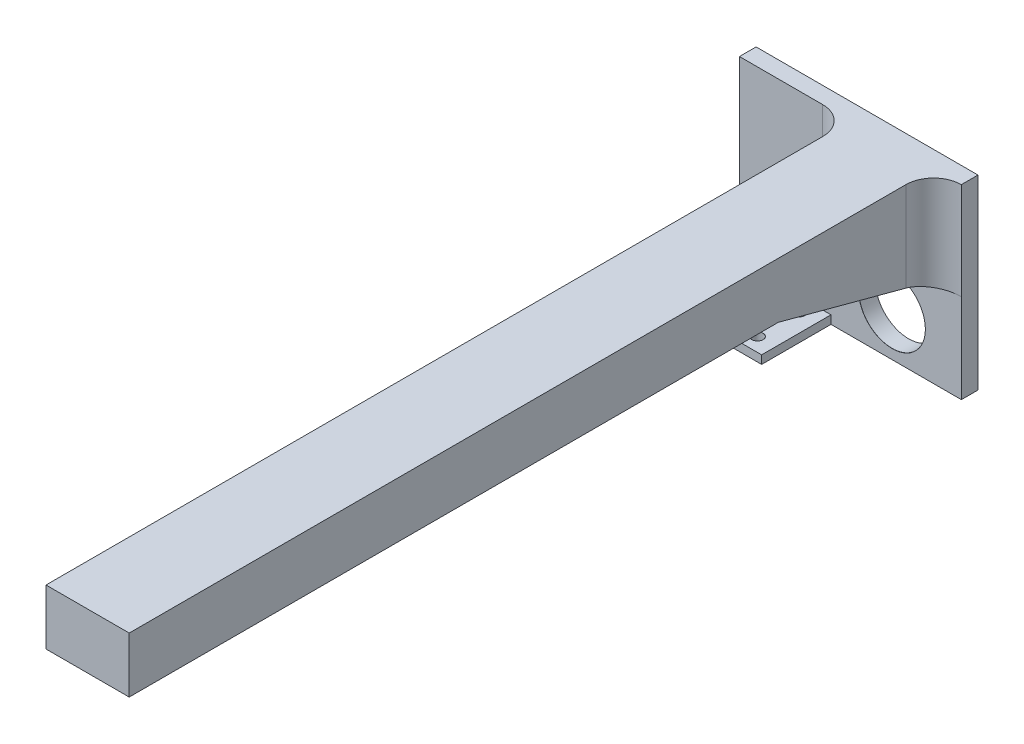
ISO-10303-21;
HEADER;
FILE_DESCRIPTION(('STEP AP214'),'2;1');
FILE_NAME('part.step','',(''),(''),'','','');
FILE_SCHEMA(('AUTOMOTIVE_DESIGN { 1 0 10303 214 1 1 1 1 }'));
ENDSEC;
DATA;
#1=APPLICATION_CONTEXT('core data for automotive mechanical design processes');
#2=APPLICATION_PROTOCOL_DEFINITION('international standard','automotive_design',2000,#1);
#3=PRODUCT_CONTEXT('',#1,'mechanical');
#4=PRODUCT('Part','Part','',(#3));
#5=PRODUCT_RELATED_PRODUCT_CATEGORY('part','',(#4));
#6=PRODUCT_DEFINITION_FORMATION('','',#4);
#7=PRODUCT_DEFINITION_CONTEXT('part definition',#1,'design');
#8=PRODUCT_DEFINITION('design','',#6,#7);
#9=PRODUCT_DEFINITION_SHAPE('','',#8);
#10=(LENGTH_UNIT() NAMED_UNIT(*) SI_UNIT(.MILLI.,.METRE.));
#11=(NAMED_UNIT(*) PLANE_ANGLE_UNIT() SI_UNIT($,.RADIAN.));
#12=(NAMED_UNIT(*) SI_UNIT($,.STERADIAN.) SOLID_ANGLE_UNIT());
#13=UNCERTAINTY_MEASURE_WITH_UNIT(LENGTH_MEASURE(1.E-05),#10,'distance_accuracy_value','');
#14=(GEOMETRIC_REPRESENTATION_CONTEXT(3) GLOBAL_UNCERTAINTY_ASSIGNED_CONTEXT((#13)) GLOBAL_UNIT_ASSIGNED_CONTEXT((#10,
#11,#12)) REPRESENTATION_CONTEXT('',''));
#15=CARTESIAN_POINT('',(0.,0.,0.));
#16=DIRECTION('',(0.,0.,1.));
#17=DIRECTION('',(1.,0.,0.));
#18=AXIS2_PLACEMENT_3D('',#15,#16,#17);
#19=CARTESIAN_POINT('',(0.,0.,3.));
#20=DIRECTION('',(0.,0.,1.));
#21=DIRECTION('',(1.,0.,0.));
#22=AXIS2_PLACEMENT_3D('',#19,#20,#21);
#23=PLANE('',#22);
#24=CARTESIAN_POINT('',(15.,-14.855,3.));
#25=DIRECTION('',(0.,0.,1.));
#26=DIRECTION('',(1.,0.,0.));
#27=AXIS2_PLACEMENT_3D('',#24,#25,#26);
#28=CIRCLE('',#27,12.025);
#29=CARTESIAN_POINT('',(27.025,-14.855,3.));
#30=VERTEX_POINT('',#29);
#31=EDGE_CURVE('E185',#30,#30,#28,.T.);
#32=ORIENTED_EDGE('',*,*,#31,.F.);
#33=EDGE_LOOP('',(#32));
#34=FACE_BOUND('',#33,.T.);
#35=DIRECTION('',(-1.,0.,0.));
#36=VECTOR('',#35,1.);
#37=CARTESIAN_POINT('',(0.,1.78500000000002,3.));
#38=LINE('',#37,#36);
#39=CARTESIAN_POINT('',(40.,1.78500000000002,3.));
#40=VERTEX_POINT('',#39);
#41=CARTESIAN_POINT('',(-9.99999999999998,1.78500000000002,3.));
#42=VERTEX_POINT('',#41);
#43=EDGE_CURVE('E315',#40,#42,#38,.T.);
#44=ORIENTED_EDGE('',*,*,#43,.T.);
#45=DIRECTION('',(0.,-1.,0.));
#46=VECTOR('',#45,1.);
#47=CARTESIAN_POINT('',(-9.99999999999998,0.,3.));
#48=LINE('',#47,#46);
#49=CARTESIAN_POINT('',(-9.99999999999999,36.785,3.));
#50=VERTEX_POINT('',#49);
#51=EDGE_CURVE('E326',#42,#50,#48,.F.);
#52=ORIENTED_EDGE('',*,*,#51,.T.);
#53=DIRECTION('',(-1.,0.,0.));
#54=VECTOR('',#53,1.);
#55=CARTESIAN_POINT('',(-40.,36.785,3.));
#56=LINE('',#55,#54);
#57=CARTESIAN_POINT('',(-40.,36.785,3.));
#58=VERTEX_POINT('',#57);
#59=EDGE_CURVE('E273',#50,#58,#56,.T.);
#60=ORIENTED_EDGE('',*,*,#59,.T.);
#61=DIRECTION('',(0.,-1.,0.));
#62=VECTOR('',#61,1.);
#63=CARTESIAN_POINT('',(-40.,36.785,3.));
#64=LINE('',#63,#62);
#65=CARTESIAN_POINT('',(-40.,-27.355,3.));
#66=VERTEX_POINT('',#65);
#67=EDGE_CURVE('E277',#58,#66,#64,.T.);
#68=ORIENTED_EDGE('',*,*,#67,.T.);
#69=DIRECTION('',(-1.,0.,0.));
#70=VECTOR('',#69,1.);
#71=CARTESIAN_POINT('',(-40.,-27.355,3.));
#72=LINE('',#71,#70);
#73=CARTESIAN_POINT('',(-7.,-27.355,3.));
#74=VERTEX_POINT('',#73);
#75=EDGE_CURVE('E237',#74,#66,#72,.T.);
#76=ORIENTED_EDGE('',*,*,#75,.F.);
#77=DIRECTION('',(0.,1.,0.));
#78=VECTOR('',#77,1.);
#79=CARTESIAN_POINT('',(-7.,-30.355,3.));
#80=LINE('',#79,#78);
#81=CARTESIAN_POINT('',(-7.,-30.355,3.));
#82=VERTEX_POINT('',#81);
#83=EDGE_CURVE('E247',#82,#74,#80,.T.);
#84=ORIENTED_EDGE('',*,*,#83,.F.);
#85=DIRECTION('',(-1.,0.,0.));
#86=VECTOR('',#85,1.);
#87=CARTESIAN_POINT('',(40.,-30.355,3.));
#88=LINE('',#87,#86);
#89=CARTESIAN_POINT('',(40.,-30.355,3.));
#90=VERTEX_POINT('',#89);
#91=EDGE_CURVE('E175',#90,#82,#88,.T.);
#92=ORIENTED_EDGE('',*,*,#91,.F.);
#93=DIRECTION('',(0.,1.,0.));
#94=VECTOR('',#93,1.);
#95=CARTESIAN_POINT('',(40.,36.785,3.));
#96=LINE('',#95,#94);
#97=EDGE_CURVE('E269',#90,#40,#96,.T.);
#98=ORIENTED_EDGE('',*,*,#97,.T.);
#99=EDGE_LOOP('',(#44,#52,#60,#68,#76,#84,#92,#98));
#100=FACE_BOUND('',#99,.T.);
#101=ADVANCED_FACE('F44',(#34,#100),#23,.T.);
#102=CARTESIAN_POINT('',(-40.,-27.355,28.));
#103=DIRECTION('',(0.,-1.,0.));
#104=DIRECTION('',(0.,0.,-1.));
#105=AXIS2_PLACEMENT_3D('',#102,#103,#104);
#106=PLANE('',#105);
#107=CARTESIAN_POINT('',(-33.5,-27.355,8.));
#108=DIRECTION('',(0.,1.,0.));
#109=DIRECTION('',(0.,0.,1.));
#110=AXIS2_PLACEMENT_3D('',#107,#108,#109);
#111=CIRCLE('',#110,2.025);
#112=CARTESIAN_POINT('',(-33.5,-27.355,10.025));
#113=VERTEX_POINT('',#112);
#114=EDGE_CURVE('E196',#113,#113,#111,.T.);
#115=ORIENTED_EDGE('',*,*,#114,.F.);
#116=EDGE_LOOP('',(#115));
#117=FACE_BOUND('',#116,.T.);
#118=CARTESIAN_POINT('',(-13.5,-27.355,8.));
#119=DIRECTION('',(0.,1.,0.));
#120=DIRECTION('',(0.,0.,1.));
#121=AXIS2_PLACEMENT_3D('',#118,#119,#120);
#122=CIRCLE('',#121,2.025);
#123=CARTESIAN_POINT('',(-13.5,-27.355,10.025));
#124=VERTEX_POINT('',#123);
#125=EDGE_CURVE('E205',#124,#124,#122,.T.);
#126=ORIENTED_EDGE('',*,*,#125,.F.);
#127=EDGE_LOOP('',(#126));
#128=FACE_BOUND('',#127,.T.);
#129=CARTESIAN_POINT('',(-13.5,-27.355,23.));
#130=DIRECTION('',(0.,1.,0.));
#131=DIRECTION('',(0.,0.,1.));
#132=AXIS2_PLACEMENT_3D('',#129,#130,#131);
#133=CIRCLE('',#132,2.025);
#134=CARTESIAN_POINT('',(-13.5,-27.355,25.025));
#135=VERTEX_POINT('',#134);
#136=EDGE_CURVE('E214',#135,#135,#133,.T.);
#137=ORIENTED_EDGE('',*,*,#136,.F.);
#138=EDGE_LOOP('',(#137));
#139=FACE_BOUND('',#138,.T.);
#140=ORIENTED_EDGE('',*,*,#75,.T.);
#141=DIRECTION('',(0.,0.,-1.));
#142=VECTOR('',#141,1.);
#143=CARTESIAN_POINT('',(-40.,-27.355,28.));
#144=LINE('',#143,#142);
#145=CARTESIAN_POINT('',(-40.,-27.355,28.));
#146=VERTEX_POINT('',#145);
#147=EDGE_CURVE('E246',#146,#66,#144,.T.);
#148=ORIENTED_EDGE('',*,*,#147,.F.);
#149=DIRECTION('',(-1.,0.,0.));
#150=VECTOR('',#149,1.);
#151=CARTESIAN_POINT('',(-40.,-27.355,28.));
#152=LINE('',#151,#150);
#153=CARTESIAN_POINT('',(-7.,-27.355,28.));
#154=VERTEX_POINT('',#153);
#155=EDGE_CURVE('E243',#154,#146,#152,.T.);
#156=ORIENTED_EDGE('',*,*,#155,.F.);
#157=DIRECTION('',(0.,0.,-1.));
#158=VECTOR('',#157,1.);
#159=CARTESIAN_POINT('',(-7.,-27.355,28.));
#160=LINE('',#159,#158);
#161=EDGE_CURVE('E257',#154,#74,#160,.T.);
#162=ORIENTED_EDGE('',*,*,#161,.T.);
#163=EDGE_LOOP('',(#140,#148,#156,#162));
#164=FACE_BOUND('',#163,.T.);
#165=CARTESIAN_POINT('',(-33.5,-27.355,23.));
#166=DIRECTION('',(0.,1.,0.));
#167=DIRECTION('',(0.,0.,1.));
#168=AXIS2_PLACEMENT_3D('',#165,#166,#167);
#169=CIRCLE('',#168,2.025);
#170=CARTESIAN_POINT('',(-33.5,-27.355,25.025));
#171=VERTEX_POINT('',#170);
#172=EDGE_CURVE('E223',#171,#171,#169,.T.);
#173=ORIENTED_EDGE('',*,*,#172,.F.);
#174=EDGE_LOOP('',(#173));
#175=FACE_BOUND('',#174,.T.);
#176=ADVANCED_FACE('F370',(#117,#128,#139,#164,#175),#106,.F.);
#177=CARTESIAN_POINT('',(40.,36.785,3.));
#178=DIRECTION('',(-1.,0.,0.));
#179=DIRECTION('',(0.,-1.,0.));
#180=AXIS2_PLACEMENT_3D('',#177,#178,#179);
#181=PLANE('',#180);
#182=ORIENTED_EDGE('',*,*,#97,.F.);
#183=DIRECTION('',(0.,0.,-1.));
#184=VECTOR('',#183,1.);
#185=CARTESIAN_POINT('',(40.,-30.355,-3.));
#186=LINE('',#185,#184);
#187=CARTESIAN_POINT('',(40.,-30.355,-3.));
#188=VERTEX_POINT('',#187);
#189=EDGE_CURVE('E170',#90,#188,#186,.T.);
#190=ORIENTED_EDGE('',*,*,#189,.T.);
#191=DIRECTION('',(0.,1.,0.));
#192=VECTOR('',#191,1.);
#193=CARTESIAN_POINT('',(40.,36.785,-3.));
#194=LINE('',#193,#192);
#195=CARTESIAN_POINT('',(40.,36.785,-3.));
#196=VERTEX_POINT('',#195);
#197=EDGE_CURVE('E268',#188,#196,#194,.T.);
#198=ORIENTED_EDGE('',*,*,#197,.T.);
#199=DIRECTION('',(0.,0.,-1.));
#200=VECTOR('',#199,1.);
#201=CARTESIAN_POINT('',(40.,36.785,3.));
#202=LINE('',#201,#200);
#203=CARTESIAN_POINT('',(40.,36.785,3.));
#204=VERTEX_POINT('',#203);
#205=EDGE_CURVE('E293',#204,#196,#202,.T.);
#206=ORIENTED_EDGE('',*,*,#205,.F.);
#207=EDGE_CURVE('E274',#40,#204,#96,.T.);
#208=ORIENTED_EDGE('',*,*,#207,.F.);
#209=EDGE_LOOP('',(#182,#190,#198,#206,#208));
#210=FACE_BOUND('',#209,.T.);
#211=ADVANCED_FACE('F347',(#210),#181,.F.);
#212=CARTESIAN_POINT('',(-40.,36.785,3.));
#213=DIRECTION('',(0.,-1.,0.));
#214=DIRECTION('',(0.,0.,-1.));
#215=AXIS2_PLACEMENT_3D('',#212,#213,#214);
#216=PLANE('',#215);
#217=DIRECTION('',(-1.,0.,0.));
#218=VECTOR('',#217,1.);
#219=CARTESIAN_POINT('',(-40.,36.785,-3.));
#220=LINE('',#219,#218);
#221=CARTESIAN_POINT('',(-40.,36.785,-3.));
#222=VERTEX_POINT('',#221);
#223=EDGE_CURVE('E283',#196,#222,#220,.T.);
#224=ORIENTED_EDGE('',*,*,#223,.T.);
#225=DIRECTION('',(0.,0.,-1.));
#226=VECTOR('',#225,1.);
#227=CARTESIAN_POINT('',(-40.,36.785,3.));
#228=LINE('',#227,#226);
#229=EDGE_CURVE('E280',#58,#222,#228,.T.);
#230=ORIENTED_EDGE('',*,*,#229,.F.);
#231=ORIENTED_EDGE('',*,*,#59,.F.);
#232=CARTESIAN_POINT('',(-9.99999999999999,36.785,13.));
#233=DIRECTION('',(0.,-1.,0.));
#234=DIRECTION('',(0.,0.,-1.));
#235=AXIS2_PLACEMENT_3D('',#232,#233,#234);
#236=CIRCLE('',#235,10.);
#237=CARTESIAN_POINT('',(0.,36.785,13.));
#238=VERTEX_POINT('',#237);
#239=EDGE_CURVE('E336',#50,#238,#236,.T.);
#240=ORIENTED_EDGE('',*,*,#239,.T.);
#241=DIRECTION('',(0.,0.,-1.));
#242=VECTOR('',#241,1.);
#243=CARTESIAN_POINT('',(0.,36.785,293.));
#244=LINE('',#243,#242);
#245=CARTESIAN_POINT('',(0.,36.785,293.));
#246=VERTEX_POINT('',#245);
#247=EDGE_CURVE('E710',#246,#238,#244,.T.);
#248=ORIENTED_EDGE('',*,*,#247,.F.);
#249=DIRECTION('',(-1.,0.,0.));
#250=VECTOR('',#249,1.);
#251=CARTESIAN_POINT('',(0.,36.785,293.));
#252=LINE('',#251,#250);
#253=CARTESIAN_POINT('',(30.,36.785,293.));
#254=VERTEX_POINT('',#253);
#255=EDGE_CURVE('E159',#254,#246,#252,.T.);
#256=ORIENTED_EDGE('',*,*,#255,.F.);
#257=DIRECTION('',(0.,0.,-1.));
#258=VECTOR('',#257,1.);
#259=CARTESIAN_POINT('',(30.,36.785,293.));
#260=LINE('',#259,#258);
#261=CARTESIAN_POINT('',(30.,36.785,13.));
#262=VERTEX_POINT('',#261);
#263=EDGE_CURVE('E177',#254,#262,#260,.T.);
#264=ORIENTED_EDGE('',*,*,#263,.T.);
#265=CARTESIAN_POINT('',(40.,36.785,13.));
#266=DIRECTION('',(0.,-1.,0.));
#267=DIRECTION('',(0.,0.,-1.));
#268=AXIS2_PLACEMENT_3D('',#265,#266,#267);
#269=CIRCLE('',#268,10.);
#270=EDGE_CURVE('E53',#262,#204,#269,.T.);
#271=ORIENTED_EDGE('',*,*,#270,.T.);
#272=ORIENTED_EDGE('',*,*,#205,.T.);
#273=EDGE_LOOP('',(#224,#230,#231,#240,#248,#256,#264,#271,#272));
#274=FACE_BOUND('',#273,.T.);
#275=ADVANCED_FACE('F342',(#274),#216,.F.);
#276=CARTESIAN_POINT('',(-40.,36.785,3.));
#277=DIRECTION('',(1.,0.,0.));
#278=DIRECTION('',(0.,1.,0.));
#279=AXIS2_PLACEMENT_3D('',#276,#277,#278);
#280=PLANE('',#279);
#281=DIRECTION('',(0.,-1.,0.));
#282=VECTOR('',#281,1.);
#283=CARTESIAN_POINT('',(-40.,36.785,-3.));
#284=LINE('',#283,#282);
#285=CARTESIAN_POINT('',(-40.,-30.355,-3.));
#286=VERTEX_POINT('',#285);
#287=EDGE_CURVE('E286',#222,#286,#284,.T.);
#288=ORIENTED_EDGE('',*,*,#287,.T.);
#289=DIRECTION('',(0.,0.,-1.));
#290=VECTOR('',#289,1.);
#291=CARTESIAN_POINT('',(-40.,-30.355,28.));
#292=LINE('',#291,#290);
#293=CARTESIAN_POINT('',(-40.,-30.355,28.));
#294=VERTEX_POINT('',#293);
#295=EDGE_CURVE('E265',#294,#286,#292,.T.);
#296=ORIENTED_EDGE('',*,*,#295,.F.);
#297=DIRECTION('',(0.,-1.,0.));
#298=VECTOR('',#297,1.);
#299=CARTESIAN_POINT('',(-40.,-30.355,28.));
#300=LINE('',#299,#298);
#301=EDGE_CURVE('E232',#146,#294,#300,.T.);
#302=ORIENTED_EDGE('',*,*,#301,.F.);
#303=ORIENTED_EDGE('',*,*,#147,.T.);
#304=ORIENTED_EDGE('',*,*,#67,.F.);
#305=ORIENTED_EDGE('',*,*,#229,.T.);
#306=EDGE_LOOP('',(#288,#296,#302,#303,#304,#305));
#307=FACE_BOUND('',#306,.T.);
#308=ADVANCED_FACE('F365',(#307),#280,.F.);
#309=CARTESIAN_POINT('',(0.,0.,-3.));
#310=DIRECTION('',(0.,0.,1.));
#311=DIRECTION('',(1.,0.,0.));
#312=AXIS2_PLACEMENT_3D('',#309,#310,#311);
#313=PLANE('',#312);
#314=CARTESIAN_POINT('',(15.,-14.855,-3.));
#315=DIRECTION('',(0.,0.,1.));
#316=DIRECTION('',(1.,0.,0.));
#317=AXIS2_PLACEMENT_3D('',#314,#315,#316);
#318=CIRCLE('',#317,12.);
#319=CARTESIAN_POINT('',(27.,-14.855,-3.));
#320=VERTEX_POINT('',#319);
#321=EDGE_CURVE('E195',#320,#320,#318,.T.);
#322=ORIENTED_EDGE('',*,*,#321,.T.);
#323=EDGE_LOOP('',(#322));
#324=FACE_BOUND('',#323,.T.);
#325=ORIENTED_EDGE('',*,*,#197,.F.);
#326=DIRECTION('',(-1.,0.,0.));
#327=VECTOR('',#326,1.);
#328=CARTESIAN_POINT('',(40.,-30.355,-3.));
#329=LINE('',#328,#327);
#330=EDGE_CURVE('E181',#188,#286,#329,.T.);
#331=ORIENTED_EDGE('',*,*,#330,.T.);
#332=ORIENTED_EDGE('',*,*,#287,.F.);
#333=ORIENTED_EDGE('',*,*,#223,.F.);
#334=EDGE_LOOP('',(#325,#331,#332,#333));
#335=FACE_BOUND('',#334,.T.);
#336=ADVANCED_FACE('F381',(#324,#335),#313,.F.);
#337=CARTESIAN_POINT('',(-40.,-30.355,28.));
#338=DIRECTION('',(0.,1.,0.));
#339=DIRECTION('',(0.,0.,1.));
#340=AXIS2_PLACEMENT_3D('',#337,#338,#339);
#341=PLANE('',#340);
#342=CARTESIAN_POINT('',(-33.5,-30.355,8.));
#343=DIRECTION('',(0.,1.,0.));
#344=DIRECTION('',(0.,0.,1.));
#345=AXIS2_PLACEMENT_3D('',#342,#343,#344);
#346=CIRCLE('',#345,2.);
#347=CARTESIAN_POINT('',(-33.5,-30.355,10.));
#348=VERTEX_POINT('',#347);
#349=EDGE_CURVE('E204',#348,#348,#346,.T.);
#350=ORIENTED_EDGE('',*,*,#349,.T.);
#351=EDGE_LOOP('',(#350));
#352=FACE_BOUND('',#351,.T.);
#353=CARTESIAN_POINT('',(-13.5,-30.355,8.));
#354=DIRECTION('',(0.,1.,0.));
#355=DIRECTION('',(0.,0.,1.));
#356=AXIS2_PLACEMENT_3D('',#353,#354,#355);
#357=CIRCLE('',#356,2.);
#358=CARTESIAN_POINT('',(-13.5,-30.355,10.));
#359=VERTEX_POINT('',#358);
#360=EDGE_CURVE('E213',#359,#359,#357,.T.);
#361=ORIENTED_EDGE('',*,*,#360,.T.);
#362=EDGE_LOOP('',(#361));
#363=FACE_BOUND('',#362,.T.);
#364=CARTESIAN_POINT('',(-13.5,-30.355,23.));
#365=DIRECTION('',(0.,1.,0.));
#366=DIRECTION('',(0.,0.,1.));
#367=AXIS2_PLACEMENT_3D('',#364,#365,#366);
#368=CIRCLE('',#367,2.);
#369=CARTESIAN_POINT('',(-13.5,-30.355,25.));
#370=VERTEX_POINT('',#369);
#371=EDGE_CURVE('E222',#370,#370,#368,.T.);
#372=ORIENTED_EDGE('',*,*,#371,.T.);
#373=EDGE_LOOP('',(#372));
#374=FACE_BOUND('',#373,.T.);
#375=CARTESIAN_POINT('',(-33.5,-30.355,23.));
#376=DIRECTION('',(0.,1.,0.));
#377=DIRECTION('',(0.,0.,1.));
#378=AXIS2_PLACEMENT_3D('',#375,#376,#377);
#379=CIRCLE('',#378,2.);
#380=CARTESIAN_POINT('',(-33.5,-30.355,25.));
#381=VERTEX_POINT('',#380);
#382=EDGE_CURVE('E231',#381,#381,#379,.T.);
#383=ORIENTED_EDGE('',*,*,#382,.T.);
#384=EDGE_LOOP('',(#383));
#385=FACE_BOUND('',#384,.T.);
#386=ORIENTED_EDGE('',*,*,#295,.T.);
#387=ORIENTED_EDGE('',*,*,#330,.F.);
#388=ORIENTED_EDGE('',*,*,#189,.F.);
#389=ORIENTED_EDGE('',*,*,#91,.T.);
#390=DIRECTION('',(0.,0.,-1.));
#391=VECTOR('',#390,1.);
#392=CARTESIAN_POINT('',(-7.,-30.355,28.));
#393=LINE('',#392,#391);
#394=CARTESIAN_POINT('',(-7.,-30.355,28.));
#395=VERTEX_POINT('',#394);
#396=EDGE_CURVE('E261',#395,#82,#393,.T.);
#397=ORIENTED_EDGE('',*,*,#396,.F.);
#398=DIRECTION('',(1.,0.,0.));
#399=VECTOR('',#398,1.);
#400=CARTESIAN_POINT('',(-40.,-30.355,28.));
#401=LINE('',#400,#399);
#402=EDGE_CURVE('E236',#294,#395,#401,.T.);
#403=ORIENTED_EDGE('',*,*,#402,.F.);
#404=EDGE_LOOP('',(#386,#387,#388,#389,#397,#403));
#405=FACE_BOUND('',#404,.T.);
#406=ADVANCED_FACE('F383',(#352,#363,#374,#385,#405),#341,.F.);
#407=CARTESIAN_POINT('',(-7.,-30.355,28.));
#408=DIRECTION('',(-1.,0.,0.));
#409=DIRECTION('',(0.,0.,1.));
#410=AXIS2_PLACEMENT_3D('',#407,#408,#409);
#411=PLANE('',#410);
#412=ORIENTED_EDGE('',*,*,#83,.T.);
#413=ORIENTED_EDGE('',*,*,#161,.F.);
#414=DIRECTION('',(0.,1.,0.));
#415=VECTOR('',#414,1.);
#416=CARTESIAN_POINT('',(-7.,-30.355,28.));
#417=LINE('',#416,#415);
#418=EDGE_CURVE('E240',#395,#154,#417,.T.);
#419=ORIENTED_EDGE('',*,*,#418,.F.);
#420=ORIENTED_EDGE('',*,*,#396,.T.);
#421=EDGE_LOOP('',(#412,#413,#419,#420));
#422=FACE_BOUND('',#421,.T.);
#423=ADVANCED_FACE('F376',(#422),#411,.F.);
#424=CARTESIAN_POINT('',(0.,0.,28.));
#425=DIRECTION('',(0.,0.,-1.));
#426=DIRECTION('',(-1.,0.,0.));
#427=AXIS2_PLACEMENT_3D('',#424,#425,#426);
#428=PLANE('',#427);
#429=ORIENTED_EDGE('',*,*,#301,.T.);
#430=ORIENTED_EDGE('',*,*,#402,.T.);
#431=ORIENTED_EDGE('',*,*,#418,.T.);
#432=ORIENTED_EDGE('',*,*,#155,.T.);
#433=EDGE_LOOP('',(#429,#430,#431,#432));
#434=FACE_BOUND('',#433,.T.);
#435=ADVANCED_FACE('F385',(#434),#428,.F.);
#436=CARTESIAN_POINT('',(-33.5,-27.355,23.));
#437=DIRECTION('',(0.,1.,0.));
#438=DIRECTION('',(0.,0.,1.));
#439=AXIS2_PLACEMENT_3D('',#436,#437,#438);
#440=CYLINDRICAL_SURFACE('',#439,2.);
#441=CARTESIAN_POINT('',(-33.5,-27.38,23.));
#442=DIRECTION('',(0.,1.,0.));
#443=DIRECTION('',(0.,0.,1.));
#444=AXIS2_PLACEMENT_3D('',#441,#442,#443);
#445=CIRCLE('',#444,2.);
#446=CARTESIAN_POINT('',(-33.5,-27.38,25.));
#447=VERTEX_POINT('',#446);
#448=EDGE_CURVE('E227',#447,#447,#445,.T.);
#449=ORIENTED_EDGE('',*,*,#448,.T.);
#450=EDGE_LOOP('',(#449));
#451=FACE_BOUND('',#450,.T.);
#452=ORIENTED_EDGE('',*,*,#382,.F.);
#453=EDGE_LOOP('',(#452));
#454=FACE_BOUND('',#453,.T.);
#455=ADVANCED_FACE('F387',(#451,#454),#440,.F.);
#456=CARTESIAN_POINT('',(-33.5,-27.355,23.));
#457=DIRECTION('',(0.,1.,0.));
#458=DIRECTION('',(0.,0.,1.));
#459=AXIS2_PLACEMENT_3D('',#456,#457,#458);
#460=CONICAL_SURFACE('',#459,2.025,0.785398163397379);
#461=ORIENTED_EDGE('',*,*,#448,.F.);
#462=EDGE_LOOP('',(#461));
#463=FACE_BOUND('',#462,.T.);
#464=ORIENTED_EDGE('',*,*,#172,.T.);
#465=EDGE_LOOP('',(#464));
#466=FACE_BOUND('',#465,.T.);
#467=ADVANCED_FACE('F393',(#463,#466),#460,.F.);
#468=CARTESIAN_POINT('',(-13.5,-27.355,23.));
#469=DIRECTION('',(0.,1.,0.));
#470=DIRECTION('',(0.,0.,1.));
#471=AXIS2_PLACEMENT_3D('',#468,#469,#470);
#472=CYLINDRICAL_SURFACE('',#471,2.);
#473=CARTESIAN_POINT('',(-13.5,-27.38,23.));
#474=DIRECTION('',(0.,1.,0.));
#475=DIRECTION('',(0.,0.,1.));
#476=AXIS2_PLACEMENT_3D('',#473,#474,#475);
#477=CIRCLE('',#476,2.);
#478=CARTESIAN_POINT('',(-13.5,-27.38,25.));
#479=VERTEX_POINT('',#478);
#480=EDGE_CURVE('E218',#479,#479,#477,.T.);
#481=ORIENTED_EDGE('',*,*,#480,.T.);
#482=EDGE_LOOP('',(#481));
#483=FACE_BOUND('',#482,.T.);
#484=ORIENTED_EDGE('',*,*,#371,.F.);
#485=EDGE_LOOP('',(#484));
#486=FACE_BOUND('',#485,.T.);
#487=ADVANCED_FACE('F614',(#483,#486),#472,.F.);
#488=CARTESIAN_POINT('',(-13.5,-27.355,23.));
#489=DIRECTION('',(0.,1.,0.));
#490=DIRECTION('',(0.,0.,1.));
#491=AXIS2_PLACEMENT_3D('',#488,#489,#490);
#492=CONICAL_SURFACE('',#491,2.025,0.785398163397448);
#493=ORIENTED_EDGE('',*,*,#480,.F.);
#494=EDGE_LOOP('',(#493));
#495=FACE_BOUND('',#494,.T.);
#496=ORIENTED_EDGE('',*,*,#136,.T.);
#497=EDGE_LOOP('',(#496));
#498=FACE_BOUND('',#497,.T.);
#499=ADVANCED_FACE('F603',(#495,#498),#492,.F.);
#500=CARTESIAN_POINT('',(-13.5,-27.355,8.));
#501=DIRECTION('',(0.,1.,0.));
#502=DIRECTION('',(0.,0.,1.));
#503=AXIS2_PLACEMENT_3D('',#500,#501,#502);
#504=CYLINDRICAL_SURFACE('',#503,2.);
#505=CARTESIAN_POINT('',(-13.5,-27.38,8.));
#506=DIRECTION('',(0.,1.,0.));
#507=DIRECTION('',(0.,0.,1.));
#508=AXIS2_PLACEMENT_3D('',#505,#506,#507);
#509=CIRCLE('',#508,2.);
#510=CARTESIAN_POINT('',(-13.5,-27.38,10.));
#511=VERTEX_POINT('',#510);
#512=EDGE_CURVE('E209',#511,#511,#509,.T.);
#513=ORIENTED_EDGE('',*,*,#512,.T.);
#514=EDGE_LOOP('',(#513));
#515=FACE_BOUND('',#514,.T.);
#516=ORIENTED_EDGE('',*,*,#360,.F.);
#517=EDGE_LOOP('',(#516));
#518=FACE_BOUND('',#517,.T.);
#519=ADVANCED_FACE('F592',(#515,#518),#504,.F.);
#520=CARTESIAN_POINT('',(-13.5,-27.355,8.));
#521=DIRECTION('',(0.,1.,0.));
#522=DIRECTION('',(0.,0.,1.));
#523=AXIS2_PLACEMENT_3D('',#520,#521,#522);
#524=CONICAL_SURFACE('',#523,2.025,0.785398163397448);
#525=ORIENTED_EDGE('',*,*,#512,.F.);
#526=EDGE_LOOP('',(#525));
#527=FACE_BOUND('',#526,.T.);
#528=ORIENTED_EDGE('',*,*,#125,.T.);
#529=EDGE_LOOP('',(#528));
#530=FACE_BOUND('',#529,.T.);
#531=ADVANCED_FACE('F581',(#527,#530),#524,.F.);
#532=CARTESIAN_POINT('',(-33.5,-27.355,8.));
#533=DIRECTION('',(0.,1.,0.));
#534=DIRECTION('',(0.,0.,1.));
#535=AXIS2_PLACEMENT_3D('',#532,#533,#534);
#536=CYLINDRICAL_SURFACE('',#535,2.);
#537=CARTESIAN_POINT('',(-33.5,-27.38,8.));
#538=DIRECTION('',(0.,1.,0.));
#539=DIRECTION('',(0.,0.,1.));
#540=AXIS2_PLACEMENT_3D('',#537,#538,#539);
#541=CIRCLE('',#540,2.);
#542=CARTESIAN_POINT('',(-33.5,-27.38,10.));
#543=VERTEX_POINT('',#542);
#544=EDGE_CURVE('E200',#543,#543,#541,.T.);
#545=ORIENTED_EDGE('',*,*,#544,.T.);
#546=EDGE_LOOP('',(#545));
#547=FACE_BOUND('',#546,.T.);
#548=ORIENTED_EDGE('',*,*,#349,.F.);
#549=EDGE_LOOP('',(#548));
#550=FACE_BOUND('',#549,.T.);
#551=ADVANCED_FACE('F570',(#547,#550),#536,.F.);
#552=CARTESIAN_POINT('',(-33.5,-27.355,8.));
#553=DIRECTION('',(0.,1.,0.));
#554=DIRECTION('',(0.,0.,1.));
#555=AXIS2_PLACEMENT_3D('',#552,#553,#554);
#556=CONICAL_SURFACE('',#555,2.025,0.785398163397379);
#557=ORIENTED_EDGE('',*,*,#544,.F.);
#558=EDGE_LOOP('',(#557));
#559=FACE_BOUND('',#558,.T.);
#560=ORIENTED_EDGE('',*,*,#114,.T.);
#561=EDGE_LOOP('',(#560));
#562=FACE_BOUND('',#561,.T.);
#563=ADVANCED_FACE('F560',(#559,#562),#556,.F.);
#564=CARTESIAN_POINT('',(15.,-14.855,3.));
#565=DIRECTION('',(0.,0.,1.));
#566=DIRECTION('',(1.,0.,0.));
#567=AXIS2_PLACEMENT_3D('',#564,#565,#566);
#568=CYLINDRICAL_SURFACE('',#567,12.);
#569=CARTESIAN_POINT('',(15.,-14.855,2.975));
#570=DIRECTION('',(0.,0.,1.));
#571=DIRECTION('',(1.,0.,0.));
#572=AXIS2_PLACEMENT_3D('',#569,#570,#571);
#573=CIRCLE('',#572,12.);
#574=CARTESIAN_POINT('',(27.,-14.855,2.975));
#575=VERTEX_POINT('',#574);
#576=EDGE_CURVE('E191',#575,#575,#573,.T.);
#577=ORIENTED_EDGE('',*,*,#576,.T.);
#578=EDGE_LOOP('',(#577));
#579=FACE_BOUND('',#578,.T.);
#580=ORIENTED_EDGE('',*,*,#321,.F.);
#581=EDGE_LOOP('',(#580));
#582=FACE_BOUND('',#581,.T.);
#583=ADVANCED_FACE('F550',(#579,#582),#568,.F.);
#584=CARTESIAN_POINT('',(15.,-14.855,3.));
#585=DIRECTION('',(0.,0.,1.));
#586=DIRECTION('',(1.,0.,0.));
#587=AXIS2_PLACEMENT_3D('',#584,#585,#586);
#588=CONICAL_SURFACE('',#587,12.025,0.785398163397431);
#589=ORIENTED_EDGE('',*,*,#576,.F.);
#590=EDGE_LOOP('',(#589));
#591=FACE_BOUND('',#590,.T.);
#592=ORIENTED_EDGE('',*,*,#31,.T.);
#593=EDGE_LOOP('',(#592));
#594=FACE_BOUND('',#593,.T.);
#595=ADVANCED_FACE('F457',(#591,#594),#588,.F.);
#596=CARTESIAN_POINT('',(0.,36.785,293.));
#597=DIRECTION('',(1.,0.,0.));
#598=DIRECTION('',(0.,1.,0.));
#599=AXIS2_PLACEMENT_3D('',#596,#597,#598);
#600=PLANE('',#599);
#601=ORIENTED_EDGE('',*,*,#247,.T.);
#602=DIRECTION('',(0.,-1.,0.));
#603=VECTOR('',#602,1.);
#604=CARTESIAN_POINT('',(0.,36.785,13.));
#605=LINE('',#604,#603);
#606=CARTESIAN_POINT('',(0.,4.46449192431117,13.));
#607=VERTEX_POINT('',#606);
#608=EDGE_CURVE('E323',#238,#607,#605,.T.);
#609=ORIENTED_EDGE('',*,*,#608,.T.);
#610=DIRECTION('',(0.,0.258819045102515,0.96592582628907));
#611=VECTOR('',#610,1.);
#612=CARTESIAN_POINT('',(0.,76.6295554337707,282.323683548744));
#613=LINE('',#612,#611);
#614=CARTESIAN_POINT('',(0.,16.785,58.9807621135344));
#615=VERTEX_POINT('',#614);
#616=EDGE_CURVE('E168',#607,#615,#613,.T.);
#617=ORIENTED_EDGE('',*,*,#616,.T.);
#618=DIRECTION('',(0.,0.,-1.));
#619=VECTOR('',#618,1.);
#620=CARTESIAN_POINT('',(0.,16.785,293.));
#621=LINE('',#620,#619);
#622=CARTESIAN_POINT('',(0.,16.785,293.));
#623=VERTEX_POINT('',#622);
#624=EDGE_CURVE('E146',#623,#615,#621,.T.);
#625=ORIENTED_EDGE('',*,*,#624,.F.);
#626=DIRECTION('',(0.,-1.,0.));
#627=VECTOR('',#626,1.);
#628=CARTESIAN_POINT('',(0.,36.785,293.));
#629=LINE('',#628,#627);
#630=EDGE_CURVE('E154',#246,#623,#629,.T.);
#631=ORIENTED_EDGE('',*,*,#630,.F.);
#632=EDGE_LOOP('',(#601,#609,#617,#625,#631));
#633=FACE_BOUND('',#632,.T.);
#634=ADVANCED_FACE('F165',(#633),#600,.F.);
#635=CARTESIAN_POINT('',(0.,16.785,293.));
#636=DIRECTION('',(0.,1.,0.));
#637=DIRECTION('',(0.,0.,1.));
#638=AXIS2_PLACEMENT_3D('',#635,#636,#637);
#639=PLANE('',#638);
#640=ORIENTED_EDGE('',*,*,#624,.T.);
#641=DIRECTION('',(1.,0.,0.));
#642=VECTOR('',#641,1.);
#643=CARTESIAN_POINT('',(0.,16.785,58.9807621135344));
#644=LINE('',#643,#642);
#645=CARTESIAN_POINT('',(30.,16.785,58.9807621135344));
#646=VERTEX_POINT('',#645);
#647=EDGE_CURVE('E297',#615,#646,#644,.T.);
#648=ORIENTED_EDGE('',*,*,#647,.T.);
#649=DIRECTION('',(0.,0.,-1.));
#650=VECTOR('',#649,1.);
#651=CARTESIAN_POINT('',(30.,16.785,293.));
#652=LINE('',#651,#650);
#653=CARTESIAN_POINT('',(30.,16.785,293.));
#654=VERTEX_POINT('',#653);
#655=EDGE_CURVE('E149',#654,#646,#652,.T.);
#656=ORIENTED_EDGE('',*,*,#655,.F.);
#657=DIRECTION('',(1.,0.,0.));
#658=VECTOR('',#657,1.);
#659=CARTESIAN_POINT('',(0.,16.785,293.));
#660=LINE('',#659,#658);
#661=EDGE_CURVE('E141',#623,#654,#660,.T.);
#662=ORIENTED_EDGE('',*,*,#661,.F.);
#663=EDGE_LOOP('',(#640,#648,#656,#662));
#664=FACE_BOUND('',#663,.T.);
#665=ADVANCED_FACE('F143',(#664),#639,.F.);
#666=CARTESIAN_POINT('',(30.,36.785,293.));
#667=DIRECTION('',(-1.,0.,0.));
#668=DIRECTION('',(0.,-1.,0.));
#669=AXIS2_PLACEMENT_3D('',#666,#667,#668);
#670=PLANE('',#669);
#671=DIRECTION('',(0.,-0.258819045102515,-0.96592582628907));
#672=VECTOR('',#671,1.);
#673=CARTESIAN_POINT('',(30.,76.6295554337707,282.323683548744));
#674=LINE('',#673,#672);
#675=CARTESIAN_POINT('',(30.,4.46449192431117,13.));
#676=VERTEX_POINT('',#675);
#677=EDGE_CURVE('E318',#646,#676,#674,.T.);
#678=ORIENTED_EDGE('',*,*,#677,.T.);
#679=DIRECTION('',(0.,1.,0.));
#680=VECTOR('',#679,1.);
#681=CARTESIAN_POINT('',(30.,36.785,13.));
#682=LINE('',#681,#680);
#683=EDGE_CURVE('E329',#676,#262,#682,.T.);
#684=ORIENTED_EDGE('',*,*,#683,.T.);
#685=ORIENTED_EDGE('',*,*,#263,.F.);
#686=DIRECTION('',(0.,1.,0.));
#687=VECTOR('',#686,1.);
#688=CARTESIAN_POINT('',(30.,36.785,293.));
#689=LINE('',#688,#687);
#690=EDGE_CURVE('E153',#654,#254,#689,.T.);
#691=ORIENTED_EDGE('',*,*,#690,.F.);
#692=ORIENTED_EDGE('',*,*,#655,.T.);
#693=EDGE_LOOP('',(#678,#684,#685,#691,#692));
#694=FACE_BOUND('',#693,.T.);
#695=ADVANCED_FACE('F352',(#694),#670,.F.);
#696=CARTESIAN_POINT('',(0.,0.,293.));
#697=DIRECTION('',(0.,0.,1.));
#698=DIRECTION('',(1.,0.,0.));
#699=AXIS2_PLACEMENT_3D('',#696,#697,#698);
#700=PLANE('',#699);
#701=ORIENTED_EDGE('',*,*,#630,.T.);
#702=ORIENTED_EDGE('',*,*,#661,.T.);
#703=ORIENTED_EDGE('',*,*,#690,.T.);
#704=ORIENTED_EDGE('',*,*,#255,.T.);
#705=EDGE_LOOP('',(#701,#702,#703,#704));
#706=FACE_BOUND('',#705,.T.);
#707=ADVANCED_FACE('F157',(#706),#700,.T.);
#708=CARTESIAN_POINT('',(0.,16.785,58.9807621135344));
#709=DIRECTION('',(0.,0.96592582628907,-0.258819045102515));
#710=DIRECTION('',(1.,0.,0.));
#711=AXIS2_PLACEMENT_3D('',#708,#709,#710);
#712=PLANE('',#711);
#713=ORIENTED_EDGE('',*,*,#616,.F.);
#714=CARTESIAN_POINT('',(-9.99999999999998,4.46449192431118,13.));
#715=DIRECTION('',(0.,0.96592582628907,-0.258819045102515));
#716=DIRECTION('',(0.,-0.258819045102515,-0.96592582628907));
#717=AXIS2_PLACEMENT_3D('',#714,#715,#716);
#718=ELLIPSE('',#717,10.3527618041008,10.);
#719=EDGE_CURVE('E332',#607,#42,#718,.T.);
#720=ORIENTED_EDGE('',*,*,#719,.T.);
#721=ORIENTED_EDGE('',*,*,#43,.F.);
#722=CARTESIAN_POINT('',(40.,4.46449192431118,13.));
#723=DIRECTION('',(0.,0.96592582628907,-0.258819045102515));
#724=DIRECTION('',(0.,0.258819045102515,0.96592582628907));
#725=AXIS2_PLACEMENT_3D('',#722,#723,#724);
#726=ELLIPSE('',#725,10.3527618041008,10.);
#727=EDGE_CURVE('E11',#40,#676,#726,.T.);
#728=ORIENTED_EDGE('',*,*,#727,.T.);
#729=ORIENTED_EDGE('',*,*,#677,.F.);
#730=ORIENTED_EDGE('',*,*,#647,.F.);
#731=EDGE_LOOP('',(#713,#720,#721,#728,#729,#730));
#732=FACE_BOUND('',#731,.T.);
#733=ADVANCED_FACE('F353',(#732),#712,.F.);
#734=CARTESIAN_POINT('',(-9.99999999999999,36.785,13.));
#735=DIRECTION('',(0.,-1.,0.));
#736=DIRECTION('',(1.,0.,0.));
#737=AXIS2_PLACEMENT_3D('',#734,#735,#736);
#738=CYLINDRICAL_SURFACE('',#737,10.);
#739=ORIENTED_EDGE('',*,*,#239,.F.);
#740=ORIENTED_EDGE('',*,*,#51,.F.);
#741=ORIENTED_EDGE('',*,*,#719,.F.);
#742=ORIENTED_EDGE('',*,*,#608,.F.);
#743=EDGE_LOOP('',(#739,#740,#741,#742));
#744=FACE_BOUND('',#743,.T.);
#745=ADVANCED_FACE('F358',(#744),#738,.F.);
#746=CARTESIAN_POINT('',(40.,36.785,13.));
#747=DIRECTION('',(0.,1.,0.));
#748=DIRECTION('',(-1.,0.,0.));
#749=AXIS2_PLACEMENT_3D('',#746,#747,#748);
#750=CYLINDRICAL_SURFACE('',#749,10.);
#751=ORIENTED_EDGE('',*,*,#727,.F.);
#752=ORIENTED_EDGE('',*,*,#207,.T.);
#753=ORIENTED_EDGE('',*,*,#270,.F.);
#754=ORIENTED_EDGE('',*,*,#683,.F.);
#755=EDGE_LOOP('',(#751,#752,#753,#754));
#756=FACE_BOUND('',#755,.T.);
#757=ADVANCED_FACE('F46',(#756),#750,.F.);
#758=CLOSED_SHELL('',(#101,#176,#211,#275,#308,#336,#406,#423,#435,#455,#467,#487,#499,#519,
#531,#551,#563,#583,#595,#634,#665,#695,#707,#733,#745,#757));
#759=MANIFOLD_SOLID_BREP('B2',#758);
#760=ADVANCED_BREP_SHAPE_REPRESENTATION('',(#18,#759),#14);
#761=SHAPE_DEFINITION_REPRESENTATION(#9,#760);
ENDSEC;
END-ISO-10303-21;
